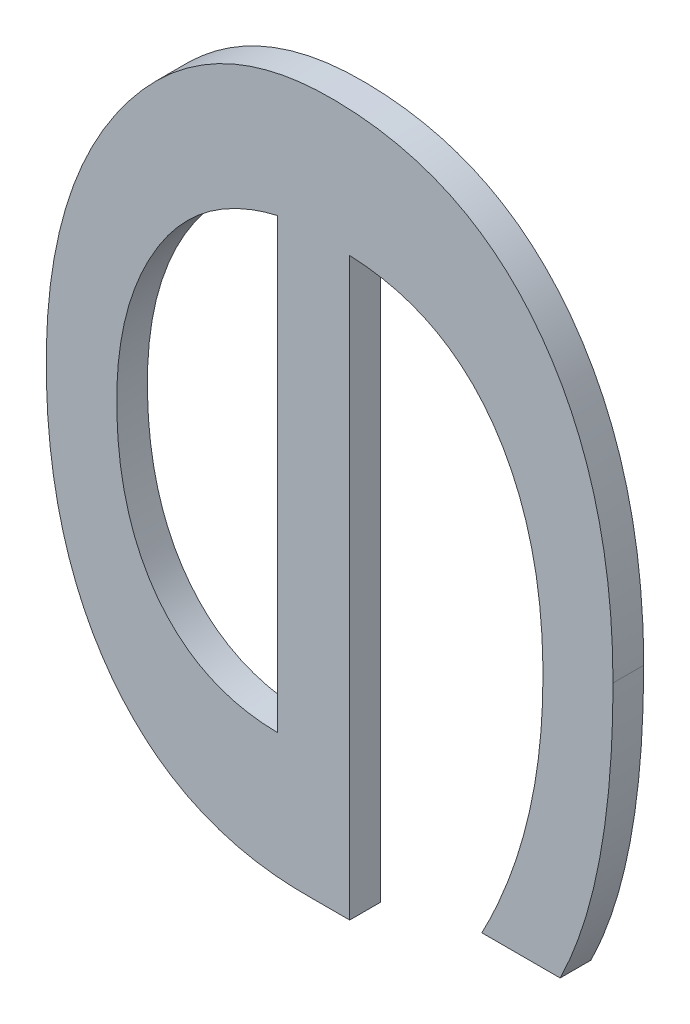
ISO-10303-21;
HEADER;
FILE_DESCRIPTION(('STEP AP214'),'2;1');
FILE_NAME('part.step','',(''),(''),'','','');
FILE_SCHEMA(('AUTOMOTIVE_DESIGN { 1 0 10303 214 1 1 1 1 }'));
ENDSEC;
DATA;
#1=APPLICATION_CONTEXT('core data for automotive mechanical design processes');
#2=APPLICATION_PROTOCOL_DEFINITION('international standard','automotive_design',2000,#1);
#3=PRODUCT_CONTEXT('',#1,'mechanical');
#4=PRODUCT('Part','Part','',(#3));
#5=PRODUCT_RELATED_PRODUCT_CATEGORY('part','',(#4));
#6=PRODUCT_DEFINITION_FORMATION('','',#4);
#7=PRODUCT_DEFINITION_CONTEXT('part definition',#1,'design');
#8=PRODUCT_DEFINITION('design','',#6,#7);
#9=PRODUCT_DEFINITION_SHAPE('','',#8);
#10=(LENGTH_UNIT() NAMED_UNIT(*) SI_UNIT(.MILLI.,.METRE.));
#11=(NAMED_UNIT(*) PLANE_ANGLE_UNIT() SI_UNIT($,.RADIAN.));
#12=(NAMED_UNIT(*) SI_UNIT($,.STERADIAN.) SOLID_ANGLE_UNIT());
#13=UNCERTAINTY_MEASURE_WITH_UNIT(LENGTH_MEASURE(1.E-05),#10,'distance_accuracy_value','');
#14=(GEOMETRIC_REPRESENTATION_CONTEXT(3) GLOBAL_UNCERTAINTY_ASSIGNED_CONTEXT((#13)) GLOBAL_UNIT_ASSIGNED_CONTEXT((#10,
#11,#12)) REPRESENTATION_CONTEXT('',''));
#15=CARTESIAN_POINT('',(0.,0.,0.));
#16=DIRECTION('',(0.,0.,1.));
#17=DIRECTION('',(1.,0.,0.));
#18=AXIS2_PLACEMENT_3D('',#15,#16,#17);
#19=CARTESIAN_POINT('',(-8.95983005625009,-22.770458436575,135.210489149433));
#20=DIRECTION('',(0.,0.,-1.));
#21=DIRECTION('',(0.,-1.,0.));
#22=AXIS2_PLACEMENT_3D('',#19,#20,#21);
#23=PLANE('',#22);
#24=DIRECTION('',(1.,0.,0.));
#25=VECTOR('',#24,1.);
#26=CARTESIAN_POINT('',(2.66453525910038E-13,-38.1187148732134,135.210489149433));
#27=LINE('',#26,#25);
#28=CARTESIAN_POINT('',(-7.57343995709141,-38.1187148732134,135.210489149433));
#29=VERTEX_POINT('',#28);
#30=CARTESIAN_POINT('',(-6.80721399555295,-38.1187148732134,135.210489149433));
#31=VERTEX_POINT('',#30);
#32=EDGE_CURVE('E145',#29,#31,#27,.T.);
#33=ORIENTED_EDGE('',*,*,#32,.T.);
#34=CARTESIAN_POINT('',(-6.80721399555295,-38.1187148732134,135.210489149433));
#35=CARTESIAN_POINT('',(-6.46241231286064,-37.4243222214354,135.210489149433));
#36=CARTESIAN_POINT('',(-6.29001147151449,-36.5048510675893,135.210489149433));
#37=CARTESIAN_POINT('',(-6.29001147151449,-35.3603014642876,135.210489149433));
#38=(BOUNDED_CURVE() B_SPLINE_CURVE(3,(#34,#35,#36,#37),.UNSPECIFIED.,.F.,
.F.) B_SPLINE_CURVE_WITH_KNOTS((4,4),(0.,1.),
.UNSPECIFIED.) CURVE() GEOMETRIC_REPRESENTATION_ITEM() RATIONAL_B_SPLINE_CURVE((1.,1.,1.,1.)) REPRESENTATION_ITEM(''));
#39=CARTESIAN_POINT('',(-6.29001147151449,-35.3603014642876,135.210489149433));
#40=VERTEX_POINT('',#39);
#41=EDGE_CURVE('E11',#31,#40,#38,.T.);
#42=ORIENTED_EDGE('',*,*,#41,.T.);
#43=CARTESIAN_POINT('',(-6.29001147151449,-35.3603014642876,135.210489149433));
#44=CARTESIAN_POINT('',(-6.29001147151449,-34.2540626797038,135.210489149433));
#45=CARTESIAN_POINT('',(-6.53105361618762,-33.3812837800957,135.210489149433));
#46=CARTESIAN_POINT('',(-7.495220558006,-32.1026438470716,135.210489149433));
#47=CARTESIAN_POINT('',(-8.17365004420736,-31.7829839537423,135.210489149433));
#48=CARTESIAN_POINT('',(-9.85296219266834,-31.7829839537423,135.210489149433));
#49=CARTESIAN_POINT('',(-10.5186208615181,-32.1289827803811,135.210489149433));
#50=CARTESIAN_POINT('',(-11.5721816938703,-33.512978413995,135.210489149433));
#51=CARTESIAN_POINT('',(-11.8355718681491,-34.3785743049203,135.210489149433));
#52=CARTESIAN_POINT('',(-11.8355718681491,-36.4378066700884,135.210489149433));
#53=CARTESIAN_POINT('',(-11.6120895507701,-37.2327663135364,135.210489149433));
#54=CARTESIAN_POINT('',(-10.7181588828609,-38.3725268488393,135.210489149433));
#55=CARTESIAN_POINT('',(-10.0956002891109,-38.6574675024201,135.210489149433));
#56=CARTESIAN_POINT('',(-9.15378100276449,-38.6574675024201,135.210489149433));
#57=CARTESIAN_POINT('',(-9.01011363497603,-38.6574675024201,135.210489149433));
#58=CARTESIAN_POINT('',(-8.86644626718757,-38.6574675024201,135.210489149433));
#59=(BOUNDED_CURVE() B_SPLINE_CURVE(3,(#43,#44,#45,#46,#47,#48,#49,#50,#51,#52,#53,#54,#55,#56,
#57,#58),.UNSPECIFIED.,.F.,.F.) B_SPLINE_CURVE_WITH_KNOTS((4,2,2,2,2,2,2,4),(0.,
0.172193607508206,0.344387118133516,0.502754827276219,0.661122495762255,0.816570914673486,
0.972019288363765,1.),
.UNSPECIFIED.) CURVE() GEOMETRIC_REPRESENTATION_ITEM() RATIONAL_B_SPLINE_CURVE((1.,1.,1.,1.,1.,
1.,1.,1.,1.,1.,1.,1.,1.,1.,1.,1.)) REPRESENTATION_ITEM(''));
#60=CARTESIAN_POINT('',(-8.86644626718757,-38.6574675024201,135.210489149433));
#61=VERTEX_POINT('',#60);
#62=EDGE_CURVE('E183',#40,#61,#59,.T.);
#63=ORIENTED_EDGE('',*,*,#62,.T.);
#64=DIRECTION('',(0.,1.,0.));
#65=VECTOR('',#64,1.);
#66=CARTESIAN_POINT('',(-8.86644626718757,5.40908312699247,135.210489149433));
#67=LINE('',#66,#65);
#68=CARTESIAN_POINT('',(-8.86644626718757,-33.0257066851125,135.210489149433));
#69=VERTEX_POINT('',#68);
#70=EDGE_CURVE('E131',#61,#69,#67,.T.);
#71=ORIENTED_EDGE('',*,*,#70,.T.);
#72=CARTESIAN_POINT('',(-8.86644626718757,-33.0257066851125,135.210489149433));
#73=CARTESIAN_POINT('',(-8.25665798141862,-33.0496511528771,135.210489149433));
#74=CARTESIAN_POINT('',(-7.78894100877411,-33.2914913155211,135.210489149433));
#75=CARTESIAN_POINT('',(-7.13764894146642,-34.2109624693674,135.210489149433));
#76=CARTESIAN_POINT('',(-6.97482592463949,-34.8407042444398,135.210489149433));
#77=CARTESIAN_POINT('',(-6.97482592463949,-36.5359791843436,135.210489149433));
#78=CARTESIAN_POINT('',(-7.17436418487931,-37.3620665491273,135.210489149433));
#79=CARTESIAN_POINT('',(-7.57343995709141,-38.1187148732134,135.210489149433));
#80=(BOUNDED_CURVE() B_SPLINE_CURVE(3,(#72,#73,#74,#75,#76,#77,#78,#79),.UNSPECIFIED.,.F.,
.F.) B_SPLINE_CURVE_WITH_KNOTS((4,2,2,4),(0.,0.320537488518306,0.641074977036609,1.),
.UNSPECIFIED.) CURVE() GEOMETRIC_REPRESENTATION_ITEM() RATIONAL_B_SPLINE_CURVE((1.,1.,1.,1.,1.,
1.,1.,1.)) REPRESENTATION_ITEM(''));
#81=EDGE_CURVE('E56',#69,#29,#80,.T.);
#82=ORIENTED_EDGE('',*,*,#81,.T.);
#83=EDGE_LOOP('',(#33,#42,#63,#71,#82));
#84=FACE_BOUND('',#83,.T.);
#85=DIRECTION('',(0.,-1.,0.));
#86=VECTOR('',#85,1.);
#87=CARTESIAN_POINT('',(-9.57041636935103,5.40908312699247,135.210489149433));
#88=LINE('',#87,#86);
#89=CARTESIAN_POINT('',(-9.57041636935103,-33.0400734218913,135.210489149433));
#90=VERTEX_POINT('',#89);
#91=CARTESIAN_POINT('',(-9.57041636935103,-37.4219281394394,135.210489149433));
#92=VERTEX_POINT('',#91);
#93=EDGE_CURVE('E84',#90,#92,#88,.T.);
#94=ORIENTED_EDGE('',*,*,#93,.T.);
#95=CARTESIAN_POINT('',(-9.57041636935103,-37.4219281394394,135.210489149433));
#96=CARTESIAN_POINT('',(-10.068463244351,-37.417138853046,135.210489149433));
#97=CARTESIAN_POINT('',(-10.4555672407841,-37.2375550367453,135.210489149433));
#98=CARTESIAN_POINT('',(-11.0078880745677,-36.5287958159543,135.210489149433));
#99=CARTESIAN_POINT('',(-11.1459685027645,-36.033143397084,135.210489149433));
#100=CARTESIAN_POINT('',(-11.1459685027645,-34.8167597766752,135.210489149433));
#101=CARTESIAN_POINT('',(-11.0070900472356,-34.3079379426245,135.210489149433));
#102=CARTESIAN_POINT('',(-10.4515762251203,-33.4315669991148,135.210489149433));
#103=CARTESIAN_POINT('',(-10.0652703867554,-33.1550073161222,135.210489149433));
#104=CARTESIAN_POINT('',(-9.57041636935103,-33.0400734218913,135.210489149433));
#105=(BOUNDED_CURVE() B_SPLINE_CURVE(3,(#95,#96,#97,#98,#99,#100,#101,#102,#103,#104),
.UNSPECIFIED.,.F.,.F.) B_SPLINE_CURVE_WITH_KNOTS((4,2,2,2,4),(0.,0.261810896992432,
0.523621917927963,0.761810958963982,1.),
.UNSPECIFIED.) CURVE() GEOMETRIC_REPRESENTATION_ITEM() RATIONAL_B_SPLINE_CURVE((1.,1.,1.,1.,1.,
1.,1.,1.,1.,1.)) REPRESENTATION_ITEM(''));
#106=EDGE_CURVE('E232',#92,#90,#105,.T.);
#107=ORIENTED_EDGE('',*,*,#106,.T.);
#108=EDGE_LOOP('',(#94,#107));
#109=FACE_BOUND('',#108,.T.);
#110=ADVANCED_FACE('F42',(#84,#109),#23,.F.);
#111=CARTESIAN_POINT('',(-6.80721399555295,-38.1187148732134,135.410489149433));
#112=CARTESIAN_POINT('',(-6.46241231286064,-37.4243222214354,135.410489149433));
#113=CARTESIAN_POINT('',(-6.29001147151449,-36.5048510675893,135.410489149433));
#114=CARTESIAN_POINT('',(-6.29001147151449,-35.3603014642876,135.410489149433));
#115=(BOUNDED_CURVE() B_SPLINE_CURVE(3,(#111,#112,#113,#114),.UNSPECIFIED.,.F.,
.F.) B_SPLINE_CURVE_WITH_KNOTS((4,4),(0.,1.),
.UNSPECIFIED.) CURVE() GEOMETRIC_REPRESENTATION_ITEM() RATIONAL_B_SPLINE_CURVE((1.,1.,1.,1.)) REPRESENTATION_ITEM(''));
#116=DIRECTION('',(0.,0.,-1.));
#117=VECTOR('',#116,1.);
#118=SURFACE_OF_LINEAR_EXTRUSION('',#115,#117);
#119=ORIENTED_EDGE('',*,*,#41,.F.);
#120=CARTESIAN_POINT('',(-6.80721399555295,-38.1187148732134,135.210489149433));
#121=CARTESIAN_POINT('',(-6.80721399555295,-38.1187148732134,134.910489149433));
#122=(BOUNDED_CURVE() B_SPLINE_CURVE(1,(#120,#121),.UNSPECIFIED.,.F.,
.F.) B_SPLINE_CURVE_WITH_KNOTS((2,2),(0.,1.),
.UNSPECIFIED.) CURVE() GEOMETRIC_REPRESENTATION_ITEM() RATIONAL_B_SPLINE_CURVE((1.,1.)) REPRESENTATION_ITEM(''));
#123=CARTESIAN_POINT('',(-6.80721399555295,-38.1187148732134,134.910489149433));
#124=VERTEX_POINT('',#123);
#125=EDGE_CURVE('E47',#31,#124,#122,.T.);
#126=ORIENTED_EDGE('',*,*,#125,.T.);
#127=CARTESIAN_POINT('',(-6.29001147151449,-35.3603014642876,134.910489149433));
#128=CARTESIAN_POINT('',(-6.29001147151449,-36.5048510675893,134.910489149433));
#129=CARTESIAN_POINT('',(-6.46241231286064,-37.4243222214354,134.910489149433));
#130=CARTESIAN_POINT('',(-6.80721399555295,-38.1187148732134,134.910489149433));
#131=(BOUNDED_CURVE() B_SPLINE_CURVE(3,(#127,#128,#129,#130),.UNSPECIFIED.,.F.,
.F.) B_SPLINE_CURVE_WITH_KNOTS((4,4),(0.,1.),
.UNSPECIFIED.) CURVE() GEOMETRIC_REPRESENTATION_ITEM() RATIONAL_B_SPLINE_CURVE((1.,1.,1.,1.)) REPRESENTATION_ITEM(''));
#132=CARTESIAN_POINT('',(-6.29001147151449,-35.3603014642876,134.910489149433));
#133=VERTEX_POINT('',#132);
#134=EDGE_CURVE('E265',#133,#124,#131,.T.);
#135=ORIENTED_EDGE('',*,*,#134,.F.);
#136=CARTESIAN_POINT('',(-6.29001147151449,-35.3603014642876,135.210489149433));
#137=CARTESIAN_POINT('',(-6.29001147151449,-35.3603014642876,134.910489149433));
#138=(BOUNDED_CURVE() B_SPLINE_CURVE(1,(#136,#137),.UNSPECIFIED.,.F.,
.F.) B_SPLINE_CURVE_WITH_KNOTS((2,2),(0.,1.),
.UNSPECIFIED.) CURVE() GEOMETRIC_REPRESENTATION_ITEM() RATIONAL_B_SPLINE_CURVE((1.,1.)) REPRESENTATION_ITEM(''));
#139=EDGE_CURVE('E140',#40,#133,#138,.T.);
#140=ORIENTED_EDGE('',*,*,#139,.F.);
#141=EDGE_LOOP('',(#119,#126,#135,#140));
#142=FACE_BOUND('',#141,.T.);
#143=ADVANCED_FACE('F44',(#142),#118,.F.);
#144=CARTESIAN_POINT('',(-8.86644626718757,-33.0257066851125,135.410489149433));
#145=CARTESIAN_POINT('',(-8.25665798141862,-33.0496511528771,135.410489149433));
#146=CARTESIAN_POINT('',(-7.78894100877411,-33.2914913155211,135.410489149433));
#147=CARTESIAN_POINT('',(-7.13764894146642,-34.2109624693674,135.410489149433));
#148=CARTESIAN_POINT('',(-6.97482592463949,-34.8407042444398,135.410489149433));
#149=CARTESIAN_POINT('',(-6.97482592463949,-36.5359791843436,135.410489149433));
#150=CARTESIAN_POINT('',(-7.17436418487931,-37.3620665491273,135.410489149433));
#151=CARTESIAN_POINT('',(-7.57343995709141,-38.1187148732134,135.410489149433));
#152=(BOUNDED_CURVE() B_SPLINE_CURVE(3,(#144,#145,#146,#147,#148,#149,#150,#151),.UNSPECIFIED.,
.F.,.F.) B_SPLINE_CURVE_WITH_KNOTS((4,2,2,4),(0.,0.320537488518306,0.641074977036609,1.),
.UNSPECIFIED.) CURVE() GEOMETRIC_REPRESENTATION_ITEM() RATIONAL_B_SPLINE_CURVE((1.,1.,1.,1.,1.,
1.,1.,1.)) REPRESENTATION_ITEM(''));
#153=DIRECTION('',(0.,0.,-1.));
#154=VECTOR('',#153,1.);
#155=SURFACE_OF_LINEAR_EXTRUSION('',#152,#154);
#156=ORIENTED_EDGE('',*,*,#81,.F.);
#157=CARTESIAN_POINT('',(-8.86644626718757,-33.0257066851125,135.210489149433));
#158=CARTESIAN_POINT('',(-8.86644626718757,-33.0257066851125,134.910489149433));
#159=(BOUNDED_CURVE() B_SPLINE_CURVE(1,(#157,#158),.UNSPECIFIED.,.F.,
.F.) B_SPLINE_CURVE_WITH_KNOTS((2,2),(0.,1.),
.UNSPECIFIED.) CURVE() GEOMETRIC_REPRESENTATION_ITEM() RATIONAL_B_SPLINE_CURVE((1.,1.)) REPRESENTATION_ITEM(''));
#160=CARTESIAN_POINT('',(-8.86644626718757,-33.0257066851125,134.910489149433));
#161=VERTEX_POINT('',#160);
#162=EDGE_CURVE('E135',#69,#161,#159,.T.);
#163=ORIENTED_EDGE('',*,*,#162,.T.);
#164=CARTESIAN_POINT('',(-7.57343995709141,-38.1187148732134,134.910489149433));
#165=CARTESIAN_POINT('',(-7.17436418487931,-37.3620665491273,134.910489149433));
#166=CARTESIAN_POINT('',(-6.97482592463949,-36.5359791843436,134.910489149433));
#167=CARTESIAN_POINT('',(-6.97482592463949,-34.8407042444398,134.910489149433));
#168=CARTESIAN_POINT('',(-7.13764894146642,-34.2109624693674,134.910489149433));
#169=CARTESIAN_POINT('',(-7.78894100877411,-33.2914913155211,134.910489149433));
#170=CARTESIAN_POINT('',(-8.25665798141862,-33.0496511528771,134.910489149433));
#171=CARTESIAN_POINT('',(-8.86644626718757,-33.0257066851125,134.910489149433));
#172=(BOUNDED_CURVE() B_SPLINE_CURVE(3,(#164,#165,#166,#167,#168,#169,#170,#171),.UNSPECIFIED.,
.F.,.F.) B_SPLINE_CURVE_WITH_KNOTS((4,2,2,4),(0.,0.358925022963391,0.679462511481694,1.),
.UNSPECIFIED.) CURVE() GEOMETRIC_REPRESENTATION_ITEM() RATIONAL_B_SPLINE_CURVE((1.,1.,1.,1.,1.,
1.,1.,1.)) REPRESENTATION_ITEM(''));
#173=CARTESIAN_POINT('',(-7.57343995709141,-38.1187148732134,134.910489149433));
#174=VERTEX_POINT('',#173);
#175=EDGE_CURVE('E151',#174,#161,#172,.T.);
#176=ORIENTED_EDGE('',*,*,#175,.F.);
#177=CARTESIAN_POINT('',(-7.57343995709141,-38.1187148732134,135.210489149433));
#178=CARTESIAN_POINT('',(-7.57343995709141,-38.1187148732134,135.110489149433));
#179=CARTESIAN_POINT('',(-7.57343995709141,-38.1187148732134,135.010489149433));
#180=CARTESIAN_POINT('',(-7.57343995709141,-38.1187148732134,134.910489149433));
#181=(BOUNDED_CURVE() B_SPLINE_CURVE(3,(#177,#178,#179,#180),.UNSPECIFIED.,.F.,
.F.) B_SPLINE_CURVE_WITH_KNOTS((4,4),(0.,1.),
.UNSPECIFIED.) CURVE() GEOMETRIC_REPRESENTATION_ITEM() RATIONAL_B_SPLINE_CURVE((1.,1.,1.,1.)) REPRESENTATION_ITEM(''));
#182=EDGE_CURVE('E212',#29,#174,#181,.T.);
#183=ORIENTED_EDGE('',*,*,#182,.F.);
#184=EDGE_LOOP('',(#156,#163,#176,#183));
#185=FACE_BOUND('',#184,.T.);
#186=ADVANCED_FACE('F307',(#185),#155,.F.);
#187=CARTESIAN_POINT('',(-6.29001147151449,-35.3603014642876,135.410489149433));
#188=CARTESIAN_POINT('',(-6.29001147151449,-34.2540626797038,135.410489149433));
#189=CARTESIAN_POINT('',(-6.53105361618762,-33.3812837800957,135.410489149433));
#190=CARTESIAN_POINT('',(-7.495220558006,-32.1026438470716,135.410489149433));
#191=CARTESIAN_POINT('',(-8.17365004420736,-31.7829839537423,135.410489149433));
#192=CARTESIAN_POINT('',(-9.85296219266834,-31.7829839537423,135.410489149433));
#193=CARTESIAN_POINT('',(-10.5186208615181,-32.1289827803811,135.410489149433));
#194=CARTESIAN_POINT('',(-11.5721816938703,-33.512978413995,135.410489149433));
#195=CARTESIAN_POINT('',(-11.8355718681491,-34.3785743049203,135.410489149433));
#196=CARTESIAN_POINT('',(-11.8355718681491,-36.4378066700884,135.410489149433));
#197=CARTESIAN_POINT('',(-11.6120895507701,-37.2327663135364,135.410489149433));
#198=CARTESIAN_POINT('',(-10.7181588828609,-38.3725268488393,135.410489149433));
#199=CARTESIAN_POINT('',(-10.0956002891109,-38.6574675024201,135.410489149433));
#200=CARTESIAN_POINT('',(-9.15378100276449,-38.6574675024201,135.410489149433));
#201=CARTESIAN_POINT('',(-9.01011363497603,-38.6574675024201,135.410489149433));
#202=CARTESIAN_POINT('',(-8.86644626718757,-38.6574675024201,135.410489149433));
#203=(BOUNDED_CURVE() B_SPLINE_CURVE(3,(#187,#188,#189,#190,#191,#192,#193,#194,#195,#196,#197,
#198,#199,#200,#201,#202),.UNSPECIFIED.,.F.,.F.) B_SPLINE_CURVE_WITH_KNOTS((4,2,2,2,2,2,2,4),
(0.,0.172193607508206,0.344387118133516,0.502754827276219,0.661122495762255,0.816570914673486,
0.972019288363765,1.),
.UNSPECIFIED.) CURVE() GEOMETRIC_REPRESENTATION_ITEM() RATIONAL_B_SPLINE_CURVE((1.,1.,1.,1.,1.,
1.,1.,1.,1.,1.,1.,1.,1.,1.,1.,1.)) REPRESENTATION_ITEM(''));
#204=DIRECTION('',(0.,0.,-1.));
#205=VECTOR('',#204,1.);
#206=SURFACE_OF_LINEAR_EXTRUSION('',#203,#205);
#207=ORIENTED_EDGE('',*,*,#62,.F.);
#208=ORIENTED_EDGE('',*,*,#139,.T.);
#209=CARTESIAN_POINT('',(-8.86644626718757,-38.6574675024201,134.910489149433));
#210=CARTESIAN_POINT('',(-9.01011363497603,-38.6574675024201,134.910489149433));
#211=CARTESIAN_POINT('',(-9.15378100276449,-38.6574675024201,134.910489149433));
#212=CARTESIAN_POINT('',(-10.0956002891109,-38.6574675024201,134.910489149433));
#213=CARTESIAN_POINT('',(-10.7181588828609,-38.3725268488393,134.910489149433));
#214=CARTESIAN_POINT('',(-11.6120895507701,-37.2327663135364,134.910489149433));
#215=CARTESIAN_POINT('',(-11.8355718681491,-36.4378066700884,134.910489149433));
#216=CARTESIAN_POINT('',(-11.8355718681491,-34.3785743049203,134.910489149433));
#217=CARTESIAN_POINT('',(-11.5721816938703,-33.512978413995,134.910489149433));
#218=CARTESIAN_POINT('',(-10.5186208615181,-32.1289827803811,134.910489149433));
#219=CARTESIAN_POINT('',(-9.85296219266834,-31.7829839537423,134.910489149433));
#220=CARTESIAN_POINT('',(-8.17365004420736,-31.7829839537423,134.910489149433));
#221=CARTESIAN_POINT('',(-7.495220558006,-32.1026438470716,134.910489149433));
#222=CARTESIAN_POINT('',(-6.53105361618762,-33.3812837800957,134.910489149433));
#223=CARTESIAN_POINT('',(-6.29001147151449,-34.2540626797038,134.910489149433));
#224=CARTESIAN_POINT('',(-6.29001147151449,-35.3603014642876,134.910489149433));
#225=(BOUNDED_CURVE() B_SPLINE_CURVE(3,(#209,#210,#211,#212,#213,#214,#215,#216,#217,#218,#219,
#220,#221,#222,#223,#224),.UNSPECIFIED.,.F.,.F.) B_SPLINE_CURVE_WITH_KNOTS((4,2,2,2,2,2,2,4),
(0.,0.0279807116362349,0.183429085326514,0.338877504237745,0.497245172723781,0.655612881866484,
0.827806392491794,1.),
.UNSPECIFIED.) CURVE() GEOMETRIC_REPRESENTATION_ITEM() RATIONAL_B_SPLINE_CURVE((1.,1.,1.,1.,1.,
1.,1.,1.,1.,1.,1.,1.,1.,1.,1.,1.)) REPRESENTATION_ITEM(''));
#226=CARTESIAN_POINT('',(-8.86644626718757,-38.6574675024201,134.910489149433));
#227=VERTEX_POINT('',#226);
#228=EDGE_CURVE('E138',#227,#133,#225,.T.);
#229=ORIENTED_EDGE('',*,*,#228,.F.);
#230=CARTESIAN_POINT('',(-8.86644626718757,-38.6574675024202,135.210489149433));
#231=CARTESIAN_POINT('',(-8.86644626718757,-38.6574675024202,135.110489149433));
#232=CARTESIAN_POINT('',(-8.86644626718757,-38.6574675024202,135.010489149433));
#233=CARTESIAN_POINT('',(-8.86644626718757,-38.6574675024202,134.910489149433));
#234=(BOUNDED_CURVE() B_SPLINE_CURVE(3,(#230,#231,#232,#233),.UNSPECIFIED.,.F.,
.F.) B_SPLINE_CURVE_WITH_KNOTS((4,4),(0.,1.),
.UNSPECIFIED.) CURVE() GEOMETRIC_REPRESENTATION_ITEM() RATIONAL_B_SPLINE_CURVE((1.,1.,1.,1.)) REPRESENTATION_ITEM(''));
#235=EDGE_CURVE('E123',#61,#227,#234,.T.);
#236=ORIENTED_EDGE('',*,*,#235,.F.);
#237=EDGE_LOOP('',(#207,#208,#229,#236));
#238=FACE_BOUND('',#237,.T.);
#239=ADVANCED_FACE('F139',(#238),#206,.F.);
#240=CARTESIAN_POINT('',(-8.86644626718757,-33.0257066851125,135.410489149433));
#241=DIRECTION('',(1.,0.,0.));
#242=DIRECTION('',(0.,1.,0.));
#243=AXIS2_PLACEMENT_3D('',#240,#241,#242);
#244=PLANE('',#243);
#245=ORIENTED_EDGE('',*,*,#70,.F.);
#246=ORIENTED_EDGE('',*,*,#235,.T.);
#247=CARTESIAN_POINT('',(-8.86644626718757,-33.0257066851125,134.910489149433));
#248=CARTESIAN_POINT('',(-8.86644626718757,-34.9029602908817,134.910489149433));
#249=CARTESIAN_POINT('',(-8.86644626718757,-36.780213896651,134.910489149433));
#250=CARTESIAN_POINT('',(-8.86644626718757,-38.6574675024201,134.910489149433));
#251=(BOUNDED_CURVE() B_SPLINE_CURVE(3,(#247,#248,#249,#250),.UNSPECIFIED.,.F.,
.F.) B_SPLINE_CURVE_WITH_KNOTS((4,4),(0.,1.),
.UNSPECIFIED.) CURVE() GEOMETRIC_REPRESENTATION_ITEM() RATIONAL_B_SPLINE_CURVE((1.,1.,1.,1.)) REPRESENTATION_ITEM(''));
#252=EDGE_CURVE('E128',#161,#227,#251,.T.);
#253=ORIENTED_EDGE('',*,*,#252,.F.);
#254=ORIENTED_EDGE('',*,*,#162,.F.);
#255=EDGE_LOOP('',(#245,#246,#253,#254));
#256=FACE_BOUND('',#255,.T.);
#257=ADVANCED_FACE('F125',(#256),#244,.T.);
#258=CARTESIAN_POINT('',(-6.80721399555295,-38.1187148732134,135.410489149433));
#259=DIRECTION('',(0.,-1.,0.));
#260=DIRECTION('',(0.,0.,-1.));
#261=AXIS2_PLACEMENT_3D('',#258,#259,#260);
#262=PLANE('',#261);
#263=ORIENTED_EDGE('',*,*,#32,.F.);
#264=ORIENTED_EDGE('',*,*,#182,.T.);
#265=CARTESIAN_POINT('',(-6.80721399555295,-38.1187148732134,134.910489149433));
#266=CARTESIAN_POINT('',(-7.06262264939911,-38.1187148732134,134.910489149433));
#267=CARTESIAN_POINT('',(-7.31803130324526,-38.1187148732134,134.910489149433));
#268=CARTESIAN_POINT('',(-7.57343995709141,-38.1187148732134,134.910489149433));
#269=(BOUNDED_CURVE() B_SPLINE_CURVE(3,(#265,#266,#267,#268),.UNSPECIFIED.,.F.,
.F.) B_SPLINE_CURVE_WITH_KNOTS((4,4),(0.,1.),
.UNSPECIFIED.) CURVE() GEOMETRIC_REPRESENTATION_ITEM() RATIONAL_B_SPLINE_CURVE((1.,1.,1.,1.)) REPRESENTATION_ITEM(''));
#270=EDGE_CURVE('E158',#124,#174,#269,.T.);
#271=ORIENTED_EDGE('',*,*,#270,.F.);
#272=ORIENTED_EDGE('',*,*,#125,.F.);
#273=EDGE_LOOP('',(#263,#264,#271,#272));
#274=FACE_BOUND('',#273,.T.);
#275=ADVANCED_FACE('F315',(#274),#262,.T.);
#276=CARTESIAN_POINT('',(-6.41931210252411,-36.9083170255719,134.910489149433));
#277=DIRECTION('',(0.,0.,1.));
#278=DIRECTION('',(1.,0.,0.));
#279=AXIS2_PLACEMENT_3D('',#276,#277,#278);
#280=PLANE('',#279);
#281=ORIENTED_EDGE('',*,*,#134,.T.);
#282=ORIENTED_EDGE('',*,*,#270,.T.);
#283=ORIENTED_EDGE('',*,*,#175,.T.);
#284=ORIENTED_EDGE('',*,*,#252,.T.);
#285=ORIENTED_EDGE('',*,*,#228,.T.);
#286=EDGE_LOOP('',(#281,#282,#283,#284,#285));
#287=FACE_BOUND('',#286,.T.);
#288=CARTESIAN_POINT('',(-9.57041636935103,-33.0400734218913,134.910489149433));
#289=CARTESIAN_POINT('',(-10.0652703867554,-33.1550073161222,134.910489149433));
#290=CARTESIAN_POINT('',(-10.4515762251203,-33.4315669991148,134.910489149433));
#291=CARTESIAN_POINT('',(-11.0070900472356,-34.3079379426245,134.910489149433));
#292=CARTESIAN_POINT('',(-11.1459685027645,-34.8167597766752,134.910489149433));
#293=CARTESIAN_POINT('',(-11.1459685027645,-36.033143397084,134.910489149433));
#294=CARTESIAN_POINT('',(-11.0078880745677,-36.5287958159543,134.910489149433));
#295=CARTESIAN_POINT('',(-10.4555672407841,-37.2375550367453,134.910489149433));
#296=CARTESIAN_POINT('',(-10.068463244351,-37.417138853046,134.910489149433));
#297=CARTESIAN_POINT('',(-9.57041636935103,-37.4219281394394,134.910489149433));
#298=(BOUNDED_CURVE() B_SPLINE_CURVE(3,(#288,#289,#290,#291,#292,#293,#294,#295,#296,#297),
.UNSPECIFIED.,.F.,.F.) B_SPLINE_CURVE_WITH_KNOTS((4,2,2,2,4),(0.,0.238189041036018,
0.476378082072037,0.738189103007568,1.),
.UNSPECIFIED.) CURVE() GEOMETRIC_REPRESENTATION_ITEM() RATIONAL_B_SPLINE_CURVE((1.,1.,1.,1.,1.,
1.,1.,1.,1.,1.)) REPRESENTATION_ITEM(''));
#299=CARTESIAN_POINT('',(-9.57041636935103,-33.0400734218913,134.910489149433));
#300=VERTEX_POINT('',#299);
#301=CARTESIAN_POINT('',(-9.57041636935103,-37.4219281394394,134.910489149433));
#302=VERTEX_POINT('',#301);
#303=EDGE_CURVE('E175',#300,#302,#298,.T.);
#304=ORIENTED_EDGE('',*,*,#303,.T.);
#305=CARTESIAN_POINT('',(-9.57041636935103,-37.4219281394394,134.910489149433));
#306=CARTESIAN_POINT('',(-9.57041636935103,-35.9613099002567,134.910489149433));
#307=CARTESIAN_POINT('',(-9.57041636935103,-34.5006916610741,134.910489149433));
#308=CARTESIAN_POINT('',(-9.57041636935103,-33.0400734218913,134.910489149433));
#309=(BOUNDED_CURVE() B_SPLINE_CURVE(3,(#305,#306,#307,#308),.UNSPECIFIED.,.F.,
.F.) B_SPLINE_CURVE_WITH_KNOTS((4,4),(0.,1.),
.UNSPECIFIED.) CURVE() GEOMETRIC_REPRESENTATION_ITEM() RATIONAL_B_SPLINE_CURVE((1.,1.,1.,1.)) REPRESENTATION_ITEM(''));
#310=EDGE_CURVE('E164',#302,#300,#309,.T.);
#311=ORIENTED_EDGE('',*,*,#310,.T.);
#312=EDGE_LOOP('',(#304,#311));
#313=FACE_BOUND('',#312,.T.);
#314=ADVANCED_FACE('F147',(#287,#313),#280,.F.);
#315=CARTESIAN_POINT('',(-9.57041636935103,-37.4219281394394,135.410489149433));
#316=DIRECTION('',(-1.,0.,0.));
#317=DIRECTION('',(0.,0.,1.));
#318=AXIS2_PLACEMENT_3D('',#315,#316,#317);
#319=PLANE('',#318);
#320=ORIENTED_EDGE('',*,*,#93,.F.);
#321=CARTESIAN_POINT('',(-9.57041636935103,-33.0400734218913,134.910489149433));
#322=CARTESIAN_POINT('',(-9.57041636935103,-33.0400734218913,135.210489149433));
#323=(BOUNDED_CURVE() B_SPLINE_CURVE(1,(#321,#322),.UNSPECIFIED.,.F.,
.F.) B_SPLINE_CURVE_WITH_KNOTS((2,2),(0.,1.),
.UNSPECIFIED.) CURVE() GEOMETRIC_REPRESENTATION_ITEM() RATIONAL_B_SPLINE_CURVE((1.,1.)) REPRESENTATION_ITEM(''));
#324=EDGE_CURVE('E168',#300,#90,#323,.T.);
#325=ORIENTED_EDGE('',*,*,#324,.F.);
#326=ORIENTED_EDGE('',*,*,#310,.F.);
#327=CARTESIAN_POINT('',(-9.57041636935103,-37.4219281394394,135.210489149433));
#328=CARTESIAN_POINT('',(-9.57041636935103,-37.4219281394394,134.910489149433));
#329=(BOUNDED_CURVE() B_SPLINE_CURVE(1,(#327,#328),.UNSPECIFIED.,.F.,
.F.) B_SPLINE_CURVE_WITH_KNOTS((2,2),(0.,1.),
.UNSPECIFIED.) CURVE() GEOMETRIC_REPRESENTATION_ITEM() RATIONAL_B_SPLINE_CURVE((1.,1.)) REPRESENTATION_ITEM(''));
#330=EDGE_CURVE('E192',#92,#302,#329,.T.);
#331=ORIENTED_EDGE('',*,*,#330,.F.);
#332=EDGE_LOOP('',(#320,#325,#326,#331));
#333=FACE_BOUND('',#332,.T.);
#334=ADVANCED_FACE('F311',(#333),#319,.T.);
#335=CARTESIAN_POINT('',(-9.57041636935103,-37.4219281394394,135.410489149433));
#336=CARTESIAN_POINT('',(-10.068463244351,-37.417138853046,135.410489149433));
#337=CARTESIAN_POINT('',(-10.4555672407841,-37.2375550367453,135.410489149433));
#338=CARTESIAN_POINT('',(-11.0078880745677,-36.5287958159543,135.410489149433));
#339=CARTESIAN_POINT('',(-11.1459685027645,-36.033143397084,135.410489149433));
#340=CARTESIAN_POINT('',(-11.1459685027645,-34.8167597766752,135.410489149433));
#341=CARTESIAN_POINT('',(-11.0070900472356,-34.3079379426245,135.410489149433));
#342=CARTESIAN_POINT('',(-10.4515762251203,-33.4315669991148,135.410489149433));
#343=CARTESIAN_POINT('',(-10.0652703867554,-33.1550073161222,135.410489149433));
#344=CARTESIAN_POINT('',(-9.57041636935103,-33.0400734218913,135.410489149433));
#345=(BOUNDED_CURVE() B_SPLINE_CURVE(3,(#335,#336,#337,#338,#339,#340,#341,#342,#343,#344),
.UNSPECIFIED.,.F.,.F.) B_SPLINE_CURVE_WITH_KNOTS((4,2,2,2,4),(0.,0.261810896992432,
0.523621917927963,0.761810958963982,1.),
.UNSPECIFIED.) CURVE() GEOMETRIC_REPRESENTATION_ITEM() RATIONAL_B_SPLINE_CURVE((1.,1.,1.,1.,1.,
1.,1.,1.,1.,1.)) REPRESENTATION_ITEM(''));
#346=DIRECTION('',(0.,0.,-1.));
#347=VECTOR('',#346,1.);
#348=SURFACE_OF_LINEAR_EXTRUSION('',#345,#347);
#349=ORIENTED_EDGE('',*,*,#106,.F.);
#350=ORIENTED_EDGE('',*,*,#330,.T.);
#351=ORIENTED_EDGE('',*,*,#303,.F.);
#352=ORIENTED_EDGE('',*,*,#324,.T.);
#353=EDGE_LOOP('',(#349,#350,#351,#352));
#354=FACE_BOUND('',#353,.T.);
#355=ADVANCED_FACE('F308',(#354),#348,.F.);
#356=CLOSED_SHELL('',(#110,#143,#186,#239,#257,#275,#314,#334,#355));
#357=MANIFOLD_SOLID_BREP('B2',#356);
#358=ADVANCED_BREP_SHAPE_REPRESENTATION('',(#18,#357),#14);
#359=SHAPE_DEFINITION_REPRESENTATION(#9,#358);
ENDSEC;
END-ISO-10303-21;
